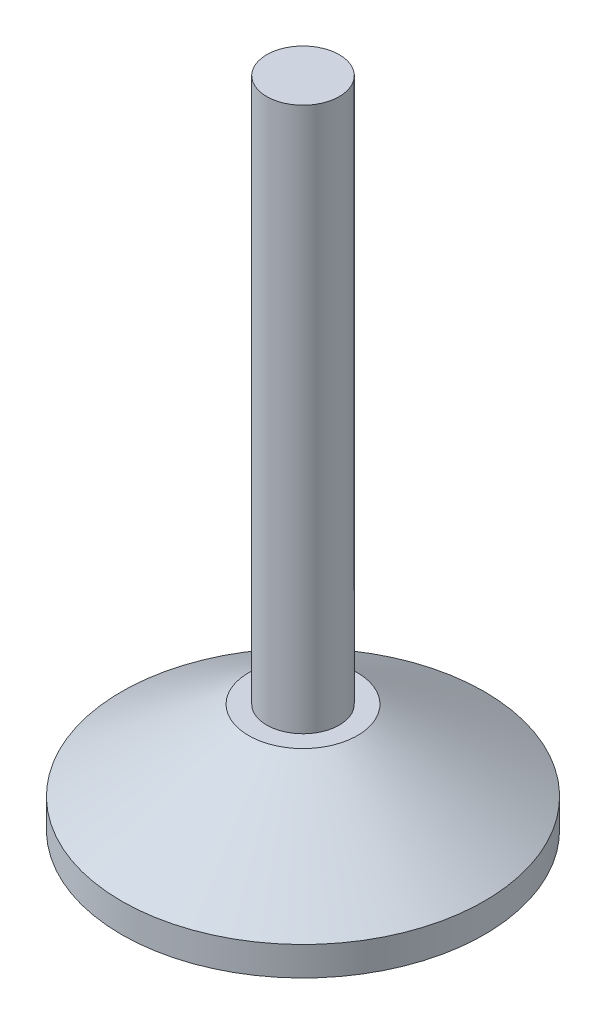
ISO-10303-21;
HEADER;
FILE_DESCRIPTION(('STEP AP214'),'2;1');
FILE_NAME('part.step','',(''),(''),'','','');
FILE_SCHEMA(('AUTOMOTIVE_DESIGN { 1 0 10303 214 1 1 1 1 }'));
ENDSEC;
DATA;
#1=APPLICATION_CONTEXT('core data for automotive mechanical design processes');
#2=APPLICATION_PROTOCOL_DEFINITION('international standard','automotive_design',2000,#1);
#3=PRODUCT_CONTEXT('',#1,'mechanical');
#4=PRODUCT('Part','Part','',(#3));
#5=PRODUCT_RELATED_PRODUCT_CATEGORY('part','',(#4));
#6=PRODUCT_DEFINITION_FORMATION('','',#4);
#7=PRODUCT_DEFINITION_CONTEXT('part definition',#1,'design');
#8=PRODUCT_DEFINITION('design','',#6,#7);
#9=PRODUCT_DEFINITION_SHAPE('','',#8);
#10=(LENGTH_UNIT() NAMED_UNIT(*) SI_UNIT(.MILLI.,.METRE.));
#11=(NAMED_UNIT(*) PLANE_ANGLE_UNIT() SI_UNIT($,.RADIAN.));
#12=(NAMED_UNIT(*) SI_UNIT($,.STERADIAN.) SOLID_ANGLE_UNIT());
#13=UNCERTAINTY_MEASURE_WITH_UNIT(LENGTH_MEASURE(1.E-05),#10,'distance_accuracy_value','');
#14=(GEOMETRIC_REPRESENTATION_CONTEXT(3) GLOBAL_UNCERTAINTY_ASSIGNED_CONTEXT((#13)) GLOBAL_UNIT_ASSIGNED_CONTEXT((#10,
#11,#12)) REPRESENTATION_CONTEXT('',''));
#15=CARTESIAN_POINT('',(0.,0.,0.));
#16=DIRECTION('',(0.,0.,1.));
#17=DIRECTION('',(1.,0.,0.));
#18=AXIS2_PLACEMENT_3D('',#15,#16,#17);
#19=CARTESIAN_POINT('',(50.,0.,0.));
#20=DIRECTION('',(0.,-1.,0.));
#21=DIRECTION('',(0.,0.,-1.));
#22=AXIS2_PLACEMENT_3D('',#19,#20,#21);
#23=PLANE('',#22);
#24=CARTESIAN_POINT('',(0.,0.,0.));
#25=DIRECTION('',(0.,-1.,0.));
#26=DIRECTION('',(0.,0.,-1.));
#27=AXIS2_PLACEMENT_3D('',#24,#25,#26);
#28=CIRCLE('',#27,50.);
#29=CARTESIAN_POINT('',(0.,0.,-50.));
#30=VERTEX_POINT('',#29);
#31=EDGE_CURVE('E66',#30,#30,#28,.T.);
#32=ORIENTED_EDGE('',*,*,#31,.T.);
#33=EDGE_LOOP('',(#32));
#34=FACE_BOUND('',#33,.T.);
#35=ADVANCED_FACE('F43',(#34),#23,.T.);
#36=CARTESIAN_POINT('',(0.,180.,0.));
#37=DIRECTION('',(0.,1.,0.));
#38=DIRECTION('',(0.,0.,1.));
#39=AXIS2_PLACEMENT_3D('',#36,#37,#38);
#40=PLANE('',#39);
#41=CARTESIAN_POINT('',(0.,180.,0.));
#42=DIRECTION('',(0.,-1.,0.));
#43=DIRECTION('',(0.,0.,-1.));
#44=AXIS2_PLACEMENT_3D('',#41,#42,#43);
#45=CIRCLE('',#44,10.);
#46=CARTESIAN_POINT('',(0.,180.,-10.));
#47=VERTEX_POINT('',#46);
#48=EDGE_CURVE('E10',#47,#47,#45,.T.);
#49=ORIENTED_EDGE('',*,*,#48,.F.);
#50=EDGE_LOOP('',(#49));
#51=FACE_BOUND('',#50,.T.);
#52=ADVANCED_FACE('F84',(#51),#40,.T.);
#53=CARTESIAN_POINT('',(0.,0.,0.));
#54=DIRECTION('',(0.,-1.,0.));
#55=DIRECTION('',(0.,0.,-1.));
#56=AXIS2_PLACEMENT_3D('',#53,#54,#55);
#57=CYLINDRICAL_SURFACE('',#56,10.);
#58=ORIENTED_EDGE('',*,*,#48,.T.);
#59=EDGE_LOOP('',(#58));
#60=FACE_BOUND('',#59,.T.);
#61=CARTESIAN_POINT('',(0.,30.,0.));
#62=DIRECTION('',(0.,-1.,0.));
#63=DIRECTION('',(0.,0.,-1.));
#64=AXIS2_PLACEMENT_3D('',#61,#62,#63);
#65=CIRCLE('',#64,10.);
#66=CARTESIAN_POINT('',(0.,30.,-10.));
#67=VERTEX_POINT('',#66);
#68=EDGE_CURVE('E50',#67,#67,#65,.T.);
#69=ORIENTED_EDGE('',*,*,#68,.F.);
#70=EDGE_LOOP('',(#69));
#71=FACE_BOUND('',#70,.T.);
#72=ADVANCED_FACE('F88',(#60,#71),#57,.T.);
#73=CARTESIAN_POINT('',(10.,30.,0.));
#74=DIRECTION('',(0.,1.,0.));
#75=DIRECTION('',(0.,0.,1.));
#76=AXIS2_PLACEMENT_3D('',#73,#74,#75);
#77=PLANE('',#76);
#78=ORIENTED_EDGE('',*,*,#68,.T.);
#79=EDGE_LOOP('',(#78));
#80=FACE_BOUND('',#79,.T.);
#81=CARTESIAN_POINT('',(0.,30.,0.));
#82=DIRECTION('',(0.,-1.,0.));
#83=DIRECTION('',(0.,0.,-1.));
#84=AXIS2_PLACEMENT_3D('',#81,#82,#83);
#85=CIRCLE('',#84,15.);
#86=CARTESIAN_POINT('',(0.,30.,-15.));
#87=VERTEX_POINT('',#86);
#88=EDGE_CURVE('E55',#87,#87,#85,.T.);
#89=ORIENTED_EDGE('',*,*,#88,.F.);
#90=EDGE_LOOP('',(#89));
#91=FACE_BOUND('',#90,.T.);
#92=ADVANCED_FACE('F80',(#80,#91),#77,.T.);
#93=CARTESIAN_POINT('',(0.,8.,0.));
#94=DIRECTION('',(0.,-1.,0.));
#95=DIRECTION('',(0.,0.,-1.));
#96=AXIS2_PLACEMENT_3D('',#93,#94,#95);
#97=CONICAL_SURFACE('',#96,50.,1.00963291450654);
#98=CARTESIAN_POINT('',(0.,8.,0.));
#99=DIRECTION('',(0.,-1.,0.));
#100=DIRECTION('',(0.,0.,-1.));
#101=AXIS2_PLACEMENT_3D('',#98,#99,#100);
#102=CIRCLE('',#101,50.);
#103=CARTESIAN_POINT('',(0.,8.,-50.));
#104=VERTEX_POINT('',#103);
#105=EDGE_CURVE('E60',#104,#104,#102,.T.);
#106=CARTESIAN_POINT('',(0.,30.,-15.));
#107=CARTESIAN_POINT('',(0.,29.7708333333333,-15.3645833333334));
#108=CARTESIAN_POINT('',(0.,29.5416666666667,-15.7291666666667));
#109=CARTESIAN_POINT('',(0.,29.0833333333333,-16.4583333333334));
#110=CARTESIAN_POINT('',(0.,28.8541666666667,-16.8229166666667));
#111=CARTESIAN_POINT('',(0.,28.3958333333333,-17.5520833333334));
#112=CARTESIAN_POINT('',(0.,28.1666666666667,-17.9166666666667));
#113=CARTESIAN_POINT('',(0.,27.7083333333333,-18.6458333333334));
#114=CARTESIAN_POINT('',(0.,27.4791666666667,-19.0104166666667));
#115=CARTESIAN_POINT('',(0.,27.0208333333333,-19.7395833333334));
#116=CARTESIAN_POINT('',(0.,26.7916666666667,-20.1041666666667));
#117=CARTESIAN_POINT('',(0.,26.3333333333333,-20.8333333333334));
#118=CARTESIAN_POINT('',(0.,26.1041666666667,-21.1979166666667));
#119=CARTESIAN_POINT('',(0.,25.6458333333333,-21.9270833333334));
#120=CARTESIAN_POINT('',(0.,25.4166666666667,-22.2916666666667));
#121=CARTESIAN_POINT('',(0.,24.9583333333333,-23.0208333333334));
#122=CARTESIAN_POINT('',(0.,24.7291666666667,-23.3854166666667));
#123=CARTESIAN_POINT('',(0.,24.2708333333333,-24.1145833333334));
#124=CARTESIAN_POINT('',(0.,24.0416666666667,-24.4791666666667));
#125=CARTESIAN_POINT('',(0.,23.5833333333333,-25.2083333333334));
#126=CARTESIAN_POINT('',(0.,23.3541666666667,-25.5729166666667));
#127=CARTESIAN_POINT('',(0.,22.8958333333333,-26.3020833333333));
#128=CARTESIAN_POINT('',(0.,22.6666666666667,-26.6666666666667));
#129=CARTESIAN_POINT('',(0.,22.2083333333333,-27.3958333333334));
#130=CARTESIAN_POINT('',(0.,21.9791666666667,-27.7604166666667));
#131=CARTESIAN_POINT('',(0.,21.5208333333333,-28.4895833333334));
#132=CARTESIAN_POINT('',(0.,21.2916666666667,-28.8541666666667));
#133=CARTESIAN_POINT('',(0.,20.8333333333333,-29.5833333333333));
#134=CARTESIAN_POINT('',(0.,20.6041666666667,-29.9479166666667));
#135=CARTESIAN_POINT('',(0.,20.1458333333333,-30.6770833333333));
#136=CARTESIAN_POINT('',(0.,19.9166666666667,-31.0416666666667));
#137=CARTESIAN_POINT('',(0.,19.4583333333333,-31.7708333333333));
#138=CARTESIAN_POINT('',(0.,19.2291666666667,-32.1354166666667));
#139=CARTESIAN_POINT('',(0.,18.7708333333333,-32.8645833333333));
#140=CARTESIAN_POINT('',(0.,18.5416666666667,-33.2291666666667));
#141=CARTESIAN_POINT('',(0.,18.0833333333333,-33.9583333333333));
#142=CARTESIAN_POINT('',(0.,17.8541666666667,-34.3229166666667));
#143=CARTESIAN_POINT('',(0.,17.3958333333333,-35.0520833333333));
#144=CARTESIAN_POINT('',(0.,17.1666666666667,-35.4166666666667));
#145=CARTESIAN_POINT('',(0.,16.7083333333333,-36.1458333333333));
#146=CARTESIAN_POINT('',(0.,16.4791666666667,-36.5104166666667));
#147=CARTESIAN_POINT('',(0.,16.0208333333333,-37.2395833333333));
#148=CARTESIAN_POINT('',(0.,15.7916666666667,-37.6041666666667));
#149=CARTESIAN_POINT('',(0.,15.3333333333333,-38.3333333333333));
#150=CARTESIAN_POINT('',(0.,15.1041666666667,-38.6979166666667));
#151=CARTESIAN_POINT('',(0.,14.6458333333333,-39.4270833333333));
#152=CARTESIAN_POINT('',(0.,14.4166666666667,-39.7916666666667));
#153=CARTESIAN_POINT('',(0.,13.9583333333333,-40.5208333333333));
#154=CARTESIAN_POINT('',(0.,13.7291666666667,-40.8854166666667));
#155=CARTESIAN_POINT('',(0.,13.2708333333333,-41.6145833333333));
#156=CARTESIAN_POINT('',(0.,13.0416666666667,-41.9791666666667));
#157=CARTESIAN_POINT('',(0.,12.5833333333333,-42.7083333333333));
#158=CARTESIAN_POINT('',(0.,12.3541666666667,-43.0729166666667));
#159=CARTESIAN_POINT('',(0.,11.8958333333333,-43.8020833333333));
#160=CARTESIAN_POINT('',(0.,11.6666666666667,-44.1666666666667));
#161=CARTESIAN_POINT('',(0.,11.2083333333333,-44.8958333333333));
#162=CARTESIAN_POINT('',(0.,10.9791666666667,-45.2604166666667));
#163=CARTESIAN_POINT('',(0.,10.5208333333333,-45.9895833333333));
#164=CARTESIAN_POINT('',(0.,10.2916666666667,-46.3541666666667));
#165=CARTESIAN_POINT('',(0.,9.83333333333333,-47.0833333333333));
#166=CARTESIAN_POINT('',(0.,9.60416666666667,-47.4479166666667));
#167=CARTESIAN_POINT('',(0.,9.14583333333334,-48.1770833333333));
#168=CARTESIAN_POINT('',(0.,8.91666666666667,-48.5416666666667));
#169=CARTESIAN_POINT('',(0.,8.45833333333334,-49.2708333333333));
#170=CARTESIAN_POINT('',(0.,8.22916666666667,-49.6354166666667));
#171=CARTESIAN_POINT('',(0.,8.,-50.));
#172=B_SPLINE_CURVE_WITH_KNOTS('',3,(#106,#107,#108,#109,#110,#111,#112,#113,#114,#115,#116,
#117,#118,#119,#120,#121,#122,#123,#124,#125,#126,#127,#128,#129,#130,#131,#132,#133,#134,#135,
#136,#137,#138,#139,#140,#141,#142,#143,#144,#145,#146,#147,#148,#149,#150,#151,#152,#153,#154,
#155,#156,#157,#158,#159,#160,#161,#162,#163,#164,#165,#166,#167,#168,#169,#170,#171),
.UNSPECIFIED.,.F.,.F.,(4,2,2,2,2,2,2,2,2,2,2,2,2,2,2,2,2,2,2,2,2,2,2,2,2,2,2,2,2,2,2,2,4),(0.,
1.29187666303715,2.5837533260743,3.87562998911144,5.16750665214859,6.45938331518574,
7.75125997822289,9.04313664126004,10.3350133042972,11.6268899673343,12.9187666303715,
14.2106432934086,15.5025199564458,16.7943966194829,18.0862732825201,19.3781499455572,
20.6700266085944,21.9619032716315,23.2537799346687,24.5456565977058,25.837533260743,
27.1294099237801,28.4212865868173,29.7131632498544,31.0050399128916,32.2969165759287,
33.5887932389659,34.880669902003,36.1725465650402,37.4644232280773,38.7562998911144,
40.0481765541516,41.3400532171887),.UNSPECIFIED.);
#173=EDGE_CURVE('BSEAM74',#87,#104,#172,.T.);
#174=ORIENTED_EDGE('',*,*,#88,.T.);
#175=ORIENTED_EDGE('',*,*,#105,.F.);
#176=ORIENTED_EDGE('',*,*,#173,.T.);
#177=ORIENTED_EDGE('',*,*,#173,.F.);
#178=EDGE_LOOP('',(#174,#176,#175,#177));
#179=FACE_BOUND('',#178,.T.);
#180=ADVANCED_FACE('F74',(#179),#97,.T.);
#181=CARTESIAN_POINT('',(0.,0.,0.));
#182=DIRECTION('',(0.,-1.,0.));
#183=DIRECTION('',(0.,0.,-1.));
#184=AXIS2_PLACEMENT_3D('',#181,#182,#183);
#185=CYLINDRICAL_SURFACE('',#184,50.);
#186=ORIENTED_EDGE('',*,*,#105,.T.);
#187=EDGE_LOOP('',(#186));
#188=FACE_BOUND('',#187,.T.);
#189=ORIENTED_EDGE('',*,*,#31,.F.);
#190=EDGE_LOOP('',(#189));
#191=FACE_BOUND('',#190,.T.);
#192=ADVANCED_FACE('F72',(#188,#191),#185,.T.);
#193=CLOSED_SHELL('',(#35,#52,#72,#92,#180,#192));
#194=MANIFOLD_SOLID_BREP('B2',#193);
#195=ADVANCED_BREP_SHAPE_REPRESENTATION('',(#18,#194),#14);
#196=SHAPE_DEFINITION_REPRESENTATION(#9,#195);
ENDSEC;
END-ISO-10303-21;
